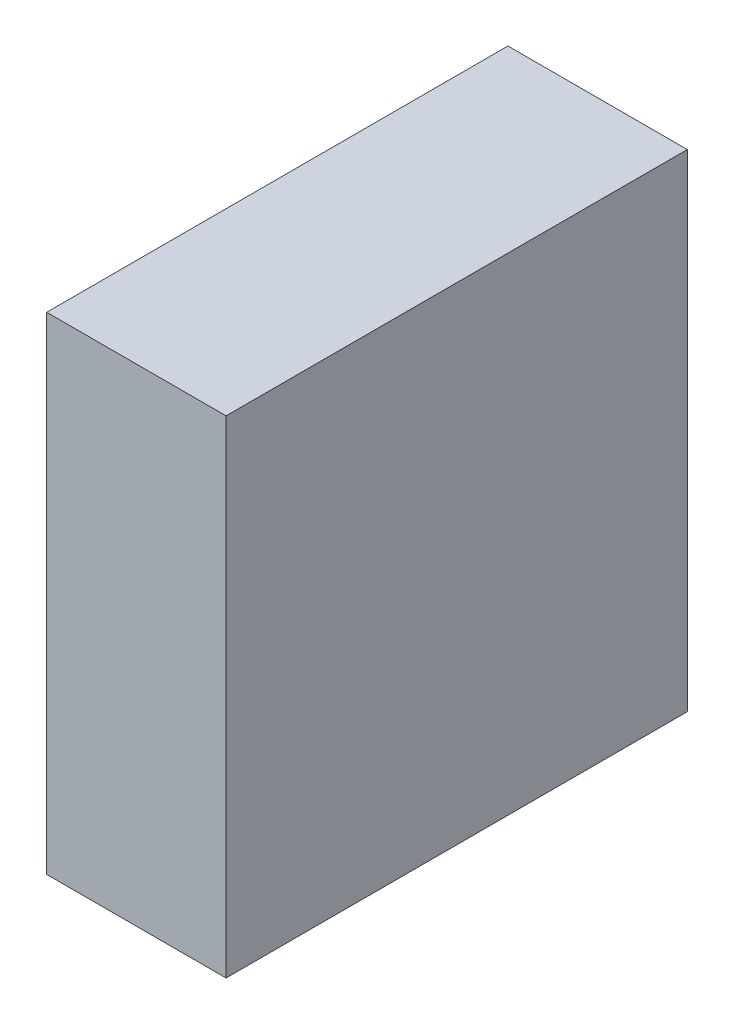
ISO-10303-21;
HEADER;
FILE_DESCRIPTION(('STEP AP214'),'2;1');
FILE_NAME('part.step','',(''),(''),'','','');
FILE_SCHEMA(('AUTOMOTIVE_DESIGN { 1 0 10303 214 1 1 1 1 }'));
ENDSEC;
DATA;
#1=APPLICATION_CONTEXT('core data for automotive mechanical design processes');
#2=APPLICATION_PROTOCOL_DEFINITION('international standard','automotive_design',2000,#1);
#3=PRODUCT_CONTEXT('',#1,'mechanical');
#4=PRODUCT('Part','Part','',(#3));
#5=PRODUCT_RELATED_PRODUCT_CATEGORY('part','',(#4));
#6=PRODUCT_DEFINITION_FORMATION('','',#4);
#7=PRODUCT_DEFINITION_CONTEXT('part definition',#1,'design');
#8=PRODUCT_DEFINITION('design','',#6,#7);
#9=PRODUCT_DEFINITION_SHAPE('','',#8);
#10=(LENGTH_UNIT() NAMED_UNIT(*) SI_UNIT(.MILLI.,.METRE.));
#11=(NAMED_UNIT(*) PLANE_ANGLE_UNIT() SI_UNIT($,.RADIAN.));
#12=(NAMED_UNIT(*) SI_UNIT($,.STERADIAN.) SOLID_ANGLE_UNIT());
#13=UNCERTAINTY_MEASURE_WITH_UNIT(LENGTH_MEASURE(1.E-05),#10,'distance_accuracy_value','');
#14=(GEOMETRIC_REPRESENTATION_CONTEXT(3) GLOBAL_UNCERTAINTY_ASSIGNED_CONTEXT((#13)) GLOBAL_UNIT_ASSIGNED_CONTEXT((#10,
#11,#12)) REPRESENTATION_CONTEXT('',''));
#15=CARTESIAN_POINT('',(0.,0.,0.));
#16=DIRECTION('',(0.,0.,1.));
#17=DIRECTION('',(1.,0.,0.));
#18=AXIS2_PLACEMENT_3D('',#15,#16,#17);
#19=CARTESIAN_POINT('',(0.17500092,-0.47500032,0.));
#20=DIRECTION('',(-1.,0.,0.));
#21=DIRECTION('',(0.,0.,1.));
#22=AXIS2_PLACEMENT_3D('',#19,#20,#21);
#23=PLANE('',#22);
#24=DIRECTION('',(0.,0.,-1.));
#25=VECTOR('',#24,1.);
#26=CARTESIAN_POINT('',(0.17500092,0.47500032,0.));
#27=LINE('',#26,#25);
#28=CARTESIAN_POINT('',(0.17500092,0.47500032,0.));
#29=VERTEX_POINT('',#28);
#30=CARTESIAN_POINT('',(0.17500092,0.47500032,0.90000074));
#31=VERTEX_POINT('',#30);
#32=EDGE_CURVE('E20',#29,#31,#27,.F.);
#33=ORIENTED_EDGE('',*,*,#32,.T.);
#34=DIRECTION('',(0.,1.,0.));
#35=VECTOR('',#34,1.);
#36=CARTESIAN_POINT('',(0.17500092,0.47500032,0.90000074));
#37=LINE('',#36,#35);
#38=CARTESIAN_POINT('',(0.17500092,-0.47500032,0.90000074));
#39=VERTEX_POINT('',#38);
#40=EDGE_CURVE('E55',#31,#39,#37,.F.);
#41=ORIENTED_EDGE('',*,*,#40,.T.);
#42=DIRECTION('',(0.,0.,1.));
#43=VECTOR('',#42,1.);
#44=CARTESIAN_POINT('',(0.17500092,-0.47500032,0.));
#45=LINE('',#44,#43);
#46=CARTESIAN_POINT('',(0.17500092,-0.47500032,0.));
#47=VERTEX_POINT('',#46);
#48=EDGE_CURVE('E76',#39,#47,#45,.F.);
#49=ORIENTED_EDGE('',*,*,#48,.T.);
#50=DIRECTION('',(0.,1.,0.));
#51=VECTOR('',#50,1.);
#52=CARTESIAN_POINT('',(0.17500092,0.47500032,0.));
#53=LINE('',#52,#51);
#54=EDGE_CURVE('E58',#29,#47,#53,.F.);
#55=ORIENTED_EDGE('',*,*,#54,.F.);
#56=EDGE_LOOP('',(#33,#41,#49,#55));
#57=FACE_BOUND('',#56,.T.);
#58=ADVANCED_FACE('F17',(#57),#23,.F.);
#59=CARTESIAN_POINT('',(0.17500092,0.47500032,0.));
#60=DIRECTION('',(0.,-1.,0.));
#61=DIRECTION('',(0.,0.,-1.));
#62=AXIS2_PLACEMENT_3D('',#59,#60,#61);
#63=PLANE('',#62);
#64=DIRECTION('',(0.,0.,-1.));
#65=VECTOR('',#64,1.);
#66=CARTESIAN_POINT('',(-0.17499838,0.47500032,0.));
#67=LINE('',#66,#65);
#68=CARTESIAN_POINT('',(-0.17499838,0.47500032,0.));
#69=VERTEX_POINT('',#68);
#70=CARTESIAN_POINT('',(-0.17499838,0.47500032,0.90000074));
#71=VERTEX_POINT('',#70);
#72=EDGE_CURVE('E73',#69,#71,#67,.F.);
#73=ORIENTED_EDGE('',*,*,#72,.T.);
#74=DIRECTION('',(-1.,0.,0.));
#75=VECTOR('',#74,1.);
#76=CARTESIAN_POINT('',(-0.17499838,0.47500032,0.90000074));
#77=LINE('',#76,#75);
#78=EDGE_CURVE('E63',#71,#31,#77,.F.);
#79=ORIENTED_EDGE('',*,*,#78,.T.);
#80=ORIENTED_EDGE('',*,*,#32,.F.);
#81=DIRECTION('',(-1.,0.,0.));
#82=VECTOR('',#81,1.);
#83=CARTESIAN_POINT('',(-0.17499838,0.47500032,0.));
#84=LINE('',#83,#82);
#85=EDGE_CURVE('E78',#69,#29,#84,.F.);
#86=ORIENTED_EDGE('',*,*,#85,.F.);
#87=EDGE_LOOP('',(#73,#79,#80,#86));
#88=FACE_BOUND('',#87,.T.);
#89=ADVANCED_FACE('F72',(#88),#63,.F.);
#90=CARTESIAN_POINT('',(-0.17499838,0.47500032,0.90000074));
#91=DIRECTION('',(0.,0.,-1.));
#92=DIRECTION('',(-1.,0.,0.));
#93=AXIS2_PLACEMENT_3D('',#90,#91,#92);
#94=PLANE('',#93);
#95=DIRECTION('',(1.,0.,0.));
#96=VECTOR('',#95,1.);
#97=CARTESIAN_POINT('',(-0.17499838,-0.47500032,0.90000074));
#98=LINE('',#97,#96);
#99=CARTESIAN_POINT('',(-0.17499838,-0.47500032,0.90000074));
#100=VERTEX_POINT('',#99);
#101=EDGE_CURVE('E69',#100,#39,#98,.T.);
#102=ORIENTED_EDGE('',*,*,#101,.T.);
#103=ORIENTED_EDGE('',*,*,#40,.F.);
#104=ORIENTED_EDGE('',*,*,#78,.F.);
#105=DIRECTION('',(0.,1.,0.));
#106=VECTOR('',#105,1.);
#107=CARTESIAN_POINT('',(-0.17499838,0.47500032,0.90000074));
#108=LINE('',#107,#106);
#109=EDGE_CURVE('E83',#71,#100,#108,.F.);
#110=ORIENTED_EDGE('',*,*,#109,.T.);
#111=EDGE_LOOP('',(#102,#103,#104,#110));
#112=FACE_BOUND('',#111,.T.);
#113=ADVANCED_FACE('F66',(#112),#94,.F.);
#114=CARTESIAN_POINT('',(-0.17499838,-0.47500032,0.));
#115=DIRECTION('',(0.,1.,0.));
#116=DIRECTION('',(0.,0.,1.));
#117=AXIS2_PLACEMENT_3D('',#114,#115,#116);
#118=PLANE('',#117);
#119=ORIENTED_EDGE('',*,*,#48,.F.);
#120=ORIENTED_EDGE('',*,*,#101,.F.);
#121=DIRECTION('',(0.,0.,-1.));
#122=VECTOR('',#121,1.);
#123=CARTESIAN_POINT('',(-0.17499838,-0.47500032,0.));
#124=LINE('',#123,#122);
#125=CARTESIAN_POINT('',(-0.17499838,-0.47500032,0.));
#126=VERTEX_POINT('',#125);
#127=EDGE_CURVE('E26',#100,#126,#124,.T.);
#128=ORIENTED_EDGE('',*,*,#127,.T.);
#129=DIRECTION('',(-1.,0.,0.));
#130=VECTOR('',#129,1.);
#131=CARTESIAN_POINT('',(-0.17499838,-0.47500032,0.));
#132=LINE('',#131,#130);
#133=EDGE_CURVE('E34',#47,#126,#132,.T.);
#134=ORIENTED_EDGE('',*,*,#133,.F.);
#135=EDGE_LOOP('',(#119,#120,#128,#134));
#136=FACE_BOUND('',#135,.T.);
#137=ADVANCED_FACE('F88',(#136),#118,.F.);
#138=CARTESIAN_POINT('',(-0.17499838,0.47500032,0.));
#139=DIRECTION('',(0.,0.,-1.));
#140=DIRECTION('',(-1.,0.,0.));
#141=AXIS2_PLACEMENT_3D('',#138,#139,#140);
#142=PLANE('',#141);
#143=ORIENTED_EDGE('',*,*,#133,.T.);
#144=DIRECTION('',(0.,1.,0.));
#145=VECTOR('',#144,1.);
#146=CARTESIAN_POINT('',(-0.17499838,0.47500032,0.));
#147=LINE('',#146,#145);
#148=EDGE_CURVE('E11',#126,#69,#147,.T.);
#149=ORIENTED_EDGE('',*,*,#148,.T.);
#150=ORIENTED_EDGE('',*,*,#85,.T.);
#151=ORIENTED_EDGE('',*,*,#54,.T.);
#152=EDGE_LOOP('',(#143,#149,#150,#151));
#153=FACE_BOUND('',#152,.T.);
#154=ADVANCED_FACE('F91',(#153),#142,.T.);
#155=CARTESIAN_POINT('',(-0.17499838,0.47500032,0.));
#156=DIRECTION('',(1.,0.,0.));
#157=DIRECTION('',(0.,0.,-1.));
#158=AXIS2_PLACEMENT_3D('',#155,#156,#157);
#159=PLANE('',#158);
#160=ORIENTED_EDGE('',*,*,#127,.F.);
#161=ORIENTED_EDGE('',*,*,#109,.F.);
#162=ORIENTED_EDGE('',*,*,#72,.F.);
#163=ORIENTED_EDGE('',*,*,#148,.F.);
#164=EDGE_LOOP('',(#160,#161,#162,#163));
#165=FACE_BOUND('',#164,.T.);
#166=ADVANCED_FACE('F90',(#165),#159,.F.);
#167=CLOSED_SHELL('',(#58,#89,#113,#137,#154,#166));
#168=MANIFOLD_SOLID_BREP('B1',#167);
#169=ADVANCED_BREP_SHAPE_REPRESENTATION('',(#18,#168),#14);
#170=SHAPE_DEFINITION_REPRESENTATION(#9,#169);
ENDSEC;
END-ISO-10303-21;
